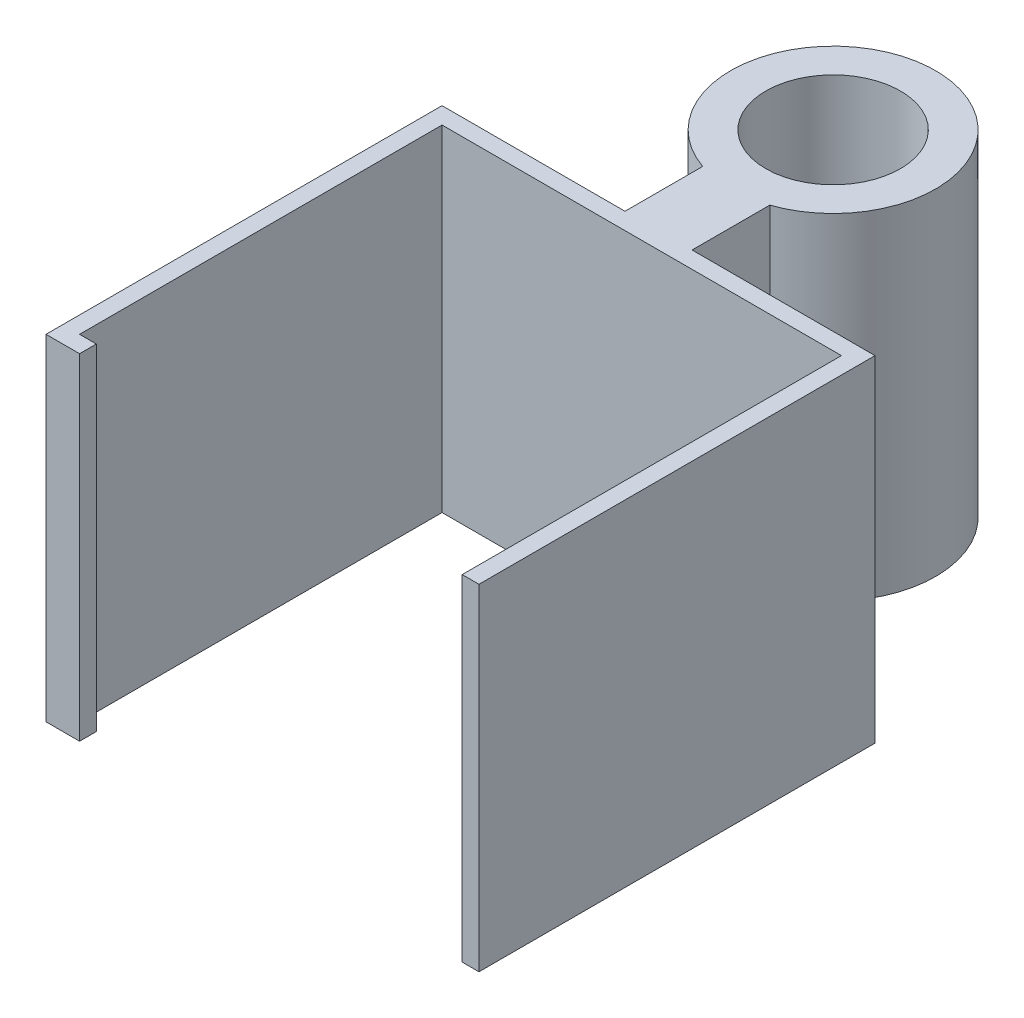
ISO-10303-21;
HEADER;
FILE_DESCRIPTION(('STEP AP214'),'2;1');
FILE_NAME('part.step','',(''),(''),'','','');
FILE_SCHEMA(('AUTOMOTIVE_DESIGN { 1 0 10303 214 1 1 1 1 }'));
ENDSEC;
DATA;
#1=APPLICATION_CONTEXT('core data for automotive mechanical design processes');
#2=APPLICATION_PROTOCOL_DEFINITION('international standard','automotive_design',2000,#1);
#3=PRODUCT_CONTEXT('',#1,'mechanical');
#4=PRODUCT('Part','Part','',(#3));
#5=PRODUCT_RELATED_PRODUCT_CATEGORY('part','',(#4));
#6=PRODUCT_DEFINITION_FORMATION('','',#4);
#7=PRODUCT_DEFINITION_CONTEXT('part definition',#1,'design');
#8=PRODUCT_DEFINITION('design','',#6,#7);
#9=PRODUCT_DEFINITION_SHAPE('','',#8);
#10=(LENGTH_UNIT() NAMED_UNIT(*) SI_UNIT(.MILLI.,.METRE.));
#11=(NAMED_UNIT(*) PLANE_ANGLE_UNIT() SI_UNIT($,.RADIAN.));
#12=(NAMED_UNIT(*) SI_UNIT($,.STERADIAN.) SOLID_ANGLE_UNIT());
#13=UNCERTAINTY_MEASURE_WITH_UNIT(LENGTH_MEASURE(1.E-05),#10,'distance_accuracy_value','');
#14=(GEOMETRIC_REPRESENTATION_CONTEXT(3) GLOBAL_UNCERTAINTY_ASSIGNED_CONTEXT((#13)) GLOBAL_UNIT_ASSIGNED_CONTEXT((#10,
#11,#12)) REPRESENTATION_CONTEXT('',''));
#15=CARTESIAN_POINT('',(0.,0.,0.));
#16=DIRECTION('',(0.,0.,1.));
#17=DIRECTION('',(1.,0.,0.));
#18=AXIS2_PLACEMENT_3D('',#15,#16,#17);
#19=CARTESIAN_POINT('',(-0.999288882711977,10.,-8.24246561615471));
#20=DIRECTION('',(1.,0.,0.));
#21=DIRECTION('',(0.,0.,-1.));
#22=AXIS2_PLACEMENT_3D('',#19,#20,#21);
#23=PLANE('',#22);
#24=DIRECTION('',(0.,-1.,0.));
#25=VECTOR('',#24,1.);
#26=CARTESIAN_POINT('',(-0.999288882711977,10.,-8.21480921571517));
#27=LINE('',#26,#25);
#28=CARTESIAN_POINT('',(-0.999288882711977,0.,-8.21480921571517));
#29=VERTEX_POINT('',#28);
#30=CARTESIAN_POINT('',(-0.999288882711977,10.,-8.21480921571517));
#31=VERTEX_POINT('',#30);
#32=EDGE_CURVE('E140',#29,#31,#27,.F.);
#33=ORIENTED_EDGE('',*,*,#32,.F.);
#34=DIRECTION('',(0.,0.,1.));
#35=VECTOR('',#34,1.);
#36=CARTESIAN_POINT('',(-0.999288882711977,0.,-8.24246561615471));
#37=LINE('',#36,#35);
#38=CARTESIAN_POINT('',(-0.999288882711977,0.,-5.9));
#39=VERTEX_POINT('',#38);
#40=EDGE_CURVE('E149',#29,#39,#37,.T.);
#41=ORIENTED_EDGE('',*,*,#40,.T.);
#42=DIRECTION('',(0.,-1.,0.));
#43=VECTOR('',#42,1.);
#44=CARTESIAN_POINT('',(-0.999288882711977,10.,-5.9));
#45=LINE('',#44,#43);
#46=CARTESIAN_POINT('',(-0.999288882711977,10.,-5.9));
#47=VERTEX_POINT('',#46);
#48=EDGE_CURVE('E171',#47,#39,#45,.T.);
#49=ORIENTED_EDGE('',*,*,#48,.F.);
#50=DIRECTION('',(0.,0.,1.));
#51=VECTOR('',#50,1.);
#52=CARTESIAN_POINT('',(-0.999288882711977,10.,-8.24246561615471));
#53=LINE('',#52,#51);
#54=EDGE_CURVE('E151',#31,#47,#53,.T.);
#55=ORIENTED_EDGE('',*,*,#54,.F.);
#56=EDGE_LOOP('',(#33,#41,#49,#55));
#57=FACE_BOUND('',#56,.T.);
#58=ADVANCED_FACE('F39',(#57),#23,.F.);
#59=CARTESIAN_POINT('',(0.999288882711974,10.,-8.24246561615471));
#60=DIRECTION('',(1.,0.,0.));
#61=DIRECTION('',(0.,0.,-1.));
#62=AXIS2_PLACEMENT_3D('',#59,#60,#61);
#63=PLANE('',#62);
#64=DIRECTION('',(0.,0.,1.));
#65=VECTOR('',#64,1.);
#66=CARTESIAN_POINT('',(0.999288882711974,0.,-8.24246561615471));
#67=LINE('',#66,#65);
#68=CARTESIAN_POINT('',(0.999288882711974,0.,-8.21480921571517));
#69=VERTEX_POINT('',#68);
#70=CARTESIAN_POINT('',(0.999288882711972,0.,-5.9));
#71=VERTEX_POINT('',#70);
#72=EDGE_CURVE('E60',#69,#71,#67,.T.);
#73=ORIENTED_EDGE('',*,*,#72,.F.);
#74=DIRECTION('',(0.,-1.,0.));
#75=VECTOR('',#74,1.);
#76=CARTESIAN_POINT('',(0.999288882711974,10.,-8.21480921571517));
#77=LINE('',#76,#75);
#78=CARTESIAN_POINT('',(0.999288882711974,10.,-8.21480921571517));
#79=VERTEX_POINT('',#78);
#80=EDGE_CURVE('E11',#69,#79,#77,.F.);
#81=ORIENTED_EDGE('',*,*,#80,.T.);
#82=DIRECTION('',(0.,0.,1.));
#83=VECTOR('',#82,1.);
#84=CARTESIAN_POINT('',(0.999288882711974,10.,-8.24246561615471));
#85=LINE('',#84,#83);
#86=CARTESIAN_POINT('',(0.999288882711974,10.,-5.9));
#87=VERTEX_POINT('',#86);
#88=EDGE_CURVE('E160',#79,#87,#85,.T.);
#89=ORIENTED_EDGE('',*,*,#88,.T.);
#90=DIRECTION('',(0.,-1.,0.));
#91=VECTOR('',#90,1.);
#92=CARTESIAN_POINT('',(0.999288882711974,10.,-5.9));
#93=LINE('',#92,#91);
#94=EDGE_CURVE('E168',#87,#71,#93,.T.);
#95=ORIENTED_EDGE('',*,*,#94,.T.);
#96=EDGE_LOOP('',(#73,#81,#89,#95));
#97=FACE_BOUND('',#96,.T.);
#98=ADVANCED_FACE('F329',(#97),#63,.T.);
#99=CARTESIAN_POINT('',(-6.45,10.,-5.9));
#100=DIRECTION('',(0.,0.,-1.));
#101=DIRECTION('',(-1.,0.,0.));
#102=AXIS2_PLACEMENT_3D('',#99,#100,#101);
#103=PLANE('',#102);
#104=DIRECTION('',(1.,0.,0.));
#105=VECTOR('',#104,1.);
#106=CARTESIAN_POINT('',(-6.45,10.,-5.9));
#107=LINE('',#106,#105);
#108=CARTESIAN_POINT('',(-6.45,10.,-5.9));
#109=VERTEX_POINT('',#108);
#110=EDGE_CURVE('E228',#109,#47,#107,.T.);
#111=ORIENTED_EDGE('',*,*,#110,.T.);
#112=ORIENTED_EDGE('',*,*,#48,.T.);
#113=DIRECTION('',(1.,0.,0.));
#114=VECTOR('',#113,1.);
#115=CARTESIAN_POINT('',(-6.45,0.,-5.9));
#116=LINE('',#115,#114);
#117=CARTESIAN_POINT('',(-6.45,0.,-5.9));
#118=VERTEX_POINT('',#117);
#119=EDGE_CURVE('E158',#118,#39,#116,.T.);
#120=ORIENTED_EDGE('',*,*,#119,.F.);
#121=DIRECTION('',(0.,-1.,0.));
#122=VECTOR('',#121,1.);
#123=CARTESIAN_POINT('',(-6.45,10.,-5.9));
#124=LINE('',#123,#122);
#125=EDGE_CURVE('E260',#109,#118,#124,.T.);
#126=ORIENTED_EDGE('',*,*,#125,.F.);
#127=EDGE_LOOP('',(#111,#112,#120,#126));
#128=FACE_BOUND('',#127,.T.);
#129=ADVANCED_FACE('F300',(#128),#103,.T.);
#130=CARTESIAN_POINT('',(-6.45,10.,5.9));
#131=DIRECTION('',(0.,0.,-1.));
#132=DIRECTION('',(-1.,0.,0.));
#133=AXIS2_PLACEMENT_3D('',#130,#131,#132);
#134=PLANE('',#133);
#135=DIRECTION('',(0.,-1.,0.));
#136=VECTOR('',#135,1.);
#137=CARTESIAN_POINT('',(-5.44902090029537,10.,5.9));
#138=LINE('',#137,#136);
#139=CARTESIAN_POINT('',(-5.44902090029537,10.,5.9));
#140=VERTEX_POINT('',#139);
#141=CARTESIAN_POINT('',(-5.44902090029537,0.,5.9));
#142=VERTEX_POINT('',#141);
#143=EDGE_CURVE('E182',#140,#142,#138,.T.);
#144=ORIENTED_EDGE('',*,*,#143,.F.);
#145=DIRECTION('',(1.,0.,0.));
#146=VECTOR('',#145,1.);
#147=CARTESIAN_POINT('',(-6.45,10.,5.9));
#148=LINE('',#147,#146);
#149=CARTESIAN_POINT('',(-6.45,10.,5.9));
#150=VERTEX_POINT('',#149);
#151=EDGE_CURVE('E238',#150,#140,#148,.T.);
#152=ORIENTED_EDGE('',*,*,#151,.F.);
#153=DIRECTION('',(0.,-1.,0.));
#154=VECTOR('',#153,1.);
#155=CARTESIAN_POINT('',(-6.45,10.,5.9));
#156=LINE('',#155,#154);
#157=CARTESIAN_POINT('',(-6.45,0.,5.9));
#158=VERTEX_POINT('',#157);
#159=EDGE_CURVE('E263',#150,#158,#156,.T.);
#160=ORIENTED_EDGE('',*,*,#159,.T.);
#161=DIRECTION('',(1.,0.,0.));
#162=VECTOR('',#161,1.);
#163=CARTESIAN_POINT('',(-6.45,0.,5.9));
#164=LINE('',#163,#162);
#165=EDGE_CURVE('E253',#158,#142,#164,.T.);
#166=ORIENTED_EDGE('',*,*,#165,.T.);
#167=EDGE_LOOP('',(#144,#152,#160,#166));
#168=FACE_BOUND('',#167,.T.);
#169=ADVANCED_FACE('F296',(#168),#134,.F.);
#170=CARTESIAN_POINT('',(-5.95,10.,5.4));
#171=DIRECTION('',(0.,0.,-1.));
#172=DIRECTION('',(-1.,0.,0.));
#173=AXIS2_PLACEMENT_3D('',#170,#171,#172);
#174=PLANE('',#173);
#175=DIRECTION('',(1.,0.,0.));
#176=VECTOR('',#175,1.);
#177=CARTESIAN_POINT('',(-5.95,10.,5.4));
#178=LINE('',#177,#176);
#179=CARTESIAN_POINT('',(-5.95,10.,5.4));
#180=VERTEX_POINT('',#179);
#181=CARTESIAN_POINT('',(-5.44902090029537,10.,5.4));
#182=VERTEX_POINT('',#181);
#183=EDGE_CURVE('E200',#180,#182,#178,.T.);
#184=ORIENTED_EDGE('',*,*,#183,.T.);
#185=DIRECTION('',(0.,-1.,0.));
#186=VECTOR('',#185,1.);
#187=CARTESIAN_POINT('',(-5.44902090029537,10.,5.4));
#188=LINE('',#187,#186);
#189=CARTESIAN_POINT('',(-5.44902090029537,0.,5.4));
#190=VERTEX_POINT('',#189);
#191=EDGE_CURVE('E48',#182,#190,#188,.T.);
#192=ORIENTED_EDGE('',*,*,#191,.T.);
#193=DIRECTION('',(1.,0.,0.));
#194=VECTOR('',#193,1.);
#195=CARTESIAN_POINT('',(-5.95,0.,5.4));
#196=LINE('',#195,#194);
#197=CARTESIAN_POINT('',(-5.95,0.,5.4));
#198=VERTEX_POINT('',#197);
#199=EDGE_CURVE('E193',#198,#190,#196,.T.);
#200=ORIENTED_EDGE('',*,*,#199,.F.);
#201=DIRECTION('',(0.,-1.,0.));
#202=VECTOR('',#201,1.);
#203=CARTESIAN_POINT('',(-5.95,10.,5.4));
#204=LINE('',#203,#202);
#205=EDGE_CURVE('E204',#180,#198,#204,.T.);
#206=ORIENTED_EDGE('',*,*,#205,.F.);
#207=EDGE_LOOP('',(#184,#192,#200,#206));
#208=FACE_BOUND('',#207,.T.);
#209=ADVANCED_FACE('F277',(#208),#174,.T.);
#210=CARTESIAN_POINT('',(0.,10.,0.));
#211=DIRECTION('',(0.,-1.,0.));
#212=DIRECTION('',(0.,0.,-1.));
#213=AXIS2_PLACEMENT_3D('',#210,#211,#212);
#214=PLANE('',#213);
#215=CARTESIAN_POINT('',(0.,10.,-11.101611725942));
#216=DIRECTION('',(0.,1.,0.));
#217=DIRECTION('',(0.,0.,1.));
#218=AXIS2_PLACEMENT_3D('',#215,#216,#217);
#219=CIRCLE('',#218,2.0063778582326);
#220=CARTESIAN_POINT('',(0.,10.,-9.09523386770937));
#221=VERTEX_POINT('',#220);
#222=EDGE_CURVE('E144',#221,#221,#219,.T.);
#223=ORIENTED_EDGE('',*,*,#222,.F.);
#224=EDGE_LOOP('',(#223));
#225=FACE_BOUND('',#224,.T.);
#226=ORIENTED_EDGE('',*,*,#88,.F.);
#227=CARTESIAN_POINT('',(0.,10.,-11.101611725942));
#228=DIRECTION('',(0.,1.,0.));
#229=DIRECTION('',(0.,0.,1.));
#230=AXIS2_PLACEMENT_3D('',#227,#228,#229);
#231=CIRCLE('',#230,3.05486611886077);
#232=EDGE_CURVE('E143',#79,#31,#231,.T.);
#233=ORIENTED_EDGE('',*,*,#232,.T.);
#234=ORIENTED_EDGE('',*,*,#54,.T.);
#235=ORIENTED_EDGE('',*,*,#110,.F.);
#236=DIRECTION('',(0.,0.,1.));
#237=VECTOR('',#236,1.);
#238=CARTESIAN_POINT('',(-6.45,10.,-5.9));
#239=LINE('',#238,#237);
#240=EDGE_CURVE('E242',#109,#150,#239,.T.);
#241=ORIENTED_EDGE('',*,*,#240,.T.);
#242=ORIENTED_EDGE('',*,*,#151,.T.);
#243=DIRECTION('',(0.,0.,1.));
#244=VECTOR('',#243,1.);
#245=CARTESIAN_POINT('',(-5.44902090029537,10.,0.));
#246=LINE('',#245,#244);
#247=EDGE_CURVE('E175',#182,#140,#246,.T.);
#248=ORIENTED_EDGE('',*,*,#247,.F.);
#249=ORIENTED_EDGE('',*,*,#183,.F.);
#250=DIRECTION('',(0.,0.,1.));
#251=VECTOR('',#250,1.);
#252=CARTESIAN_POINT('',(-5.95,10.,-5.4));
#253=LINE('',#252,#251);
#254=CARTESIAN_POINT('',(-5.95,10.,-5.4));
#255=VERTEX_POINT('',#254);
#256=EDGE_CURVE('E196',#255,#180,#253,.T.);
#257=ORIENTED_EDGE('',*,*,#256,.F.);
#258=DIRECTION('',(-1.,0.,0.));
#259=VECTOR('',#258,1.);
#260=CARTESIAN_POINT('',(-5.95,10.,-5.4));
#261=LINE('',#260,#259);
#262=CARTESIAN_POINT('',(5.95,10.,-5.4));
#263=VERTEX_POINT('',#262);
#264=EDGE_CURVE('E192',#263,#255,#261,.T.);
#265=ORIENTED_EDGE('',*,*,#264,.F.);
#266=DIRECTION('',(0.,0.,-1.));
#267=VECTOR('',#266,1.);
#268=CARTESIAN_POINT('',(5.95,10.,-5.4));
#269=LINE('',#268,#267);
#270=CARTESIAN_POINT('',(5.95,10.,5.9));
#271=VERTEX_POINT('',#270);
#272=EDGE_CURVE('E189',#271,#263,#269,.T.);
#273=ORIENTED_EDGE('',*,*,#272,.F.);
#274=CARTESIAN_POINT('',(6.45,10.,5.9));
#275=VERTEX_POINT('',#274);
#276=EDGE_CURVE('E237',#271,#275,#148,.T.);
#277=ORIENTED_EDGE('',*,*,#276,.T.);
#278=DIRECTION('',(0.,0.,1.));
#279=VECTOR('',#278,1.);
#280=CARTESIAN_POINT('',(6.45,10.,-5.9));
#281=LINE('',#280,#279);
#282=CARTESIAN_POINT('',(6.45,10.,-5.9));
#283=VERTEX_POINT('',#282);
#284=EDGE_CURVE('E232',#283,#275,#281,.T.);
#285=ORIENTED_EDGE('',*,*,#284,.F.);
#286=EDGE_CURVE('E233',#87,#283,#107,.T.);
#287=ORIENTED_EDGE('',*,*,#286,.F.);
#288=EDGE_LOOP('',(#226,#233,#234,#235,#241,#242,#248,#249,#257,#265,#273,#277,#285,#287));
#289=FACE_BOUND('',#288,.T.);
#290=ADVANCED_FACE('F291',(#225,#289),#214,.F.);
#291=CARTESIAN_POINT('',(0.,0.,0.));
#292=DIRECTION('',(0.,-1.,0.));
#293=DIRECTION('',(0.,0.,-1.));
#294=AXIS2_PLACEMENT_3D('',#291,#292,#293);
#295=PLANE('',#294);
#296=CARTESIAN_POINT('',(0.,0.,-11.101611725942));
#297=DIRECTION('',(0.,1.,0.));
#298=DIRECTION('',(0.,0.,1.));
#299=AXIS2_PLACEMENT_3D('',#296,#297,#298);
#300=CIRCLE('',#299,2.0063778582326);
#301=CARTESIAN_POINT('',(0.,0.,-9.09523386770937));
#302=VERTEX_POINT('',#301);
#303=EDGE_CURVE('E307',#302,#302,#300,.T.);
#304=ORIENTED_EDGE('',*,*,#303,.T.);
#305=EDGE_LOOP('',(#304));
#306=FACE_BOUND('',#305,.T.);
#307=ORIENTED_EDGE('',*,*,#40,.F.);
#308=CARTESIAN_POINT('',(0.,0.,-11.101611725942));
#309=DIRECTION('',(0.,1.,0.));
#310=DIRECTION('',(0.,0.,1.));
#311=AXIS2_PLACEMENT_3D('',#308,#309,#310);
#312=CIRCLE('',#311,3.05486611886077);
#313=EDGE_CURVE('E55',#69,#29,#312,.T.);
#314=ORIENTED_EDGE('',*,*,#313,.F.);
#315=ORIENTED_EDGE('',*,*,#72,.T.);
#316=CARTESIAN_POINT('',(6.45,0.,-5.9));
#317=VERTEX_POINT('',#316);
#318=EDGE_CURVE('E227',#71,#317,#116,.T.);
#319=ORIENTED_EDGE('',*,*,#318,.T.);
#320=DIRECTION('',(0.,0.,1.));
#321=VECTOR('',#320,1.);
#322=CARTESIAN_POINT('',(6.45,0.,-5.9));
#323=LINE('',#322,#321);
#324=CARTESIAN_POINT('',(6.45,0.,5.9));
#325=VERTEX_POINT('',#324);
#326=EDGE_CURVE('E248',#317,#325,#323,.T.);
#327=ORIENTED_EDGE('',*,*,#326,.T.);
#328=CARTESIAN_POINT('',(5.95,0.,5.9));
#329=VERTEX_POINT('',#328);
#330=EDGE_CURVE('E252',#329,#325,#164,.T.);
#331=ORIENTED_EDGE('',*,*,#330,.F.);
#332=DIRECTION('',(0.,0.,-1.));
#333=VECTOR('',#332,1.);
#334=CARTESIAN_POINT('',(5.95,0.,-5.4));
#335=LINE('',#334,#333);
#336=CARTESIAN_POINT('',(5.95,0.,-5.4));
#337=VERTEX_POINT('',#336);
#338=EDGE_CURVE('E185',#329,#337,#335,.T.);
#339=ORIENTED_EDGE('',*,*,#338,.T.);
#340=DIRECTION('',(-1.,0.,0.));
#341=VECTOR('',#340,1.);
#342=CARTESIAN_POINT('',(-5.95,0.,-5.4));
#343=LINE('',#342,#341);
#344=CARTESIAN_POINT('',(-5.95,0.,-5.4));
#345=VERTEX_POINT('',#344);
#346=EDGE_CURVE('E207',#337,#345,#343,.T.);
#347=ORIENTED_EDGE('',*,*,#346,.T.);
#348=DIRECTION('',(0.,0.,1.));
#349=VECTOR('',#348,1.);
#350=CARTESIAN_POINT('',(-5.95,0.,-5.4));
#351=LINE('',#350,#349);
#352=EDGE_CURVE('E210',#345,#198,#351,.T.);
#353=ORIENTED_EDGE('',*,*,#352,.T.);
#354=ORIENTED_EDGE('',*,*,#199,.T.);
#355=DIRECTION('',(0.,0.,1.));
#356=VECTOR('',#355,1.);
#357=CARTESIAN_POINT('',(-5.44902090029537,0.,0.));
#358=LINE('',#357,#356);
#359=EDGE_CURVE('E174',#190,#142,#358,.T.);
#360=ORIENTED_EDGE('',*,*,#359,.T.);
#361=ORIENTED_EDGE('',*,*,#165,.F.);
#362=DIRECTION('',(0.,0.,1.));
#363=VECTOR('',#362,1.);
#364=CARTESIAN_POINT('',(-6.45,0.,-5.9));
#365=LINE('',#364,#363);
#366=EDGE_CURVE('E257',#118,#158,#365,.T.);
#367=ORIENTED_EDGE('',*,*,#366,.F.);
#368=ORIENTED_EDGE('',*,*,#119,.T.);
#369=EDGE_LOOP('',(#307,#314,#315,#319,#327,#331,#339,#347,#353,#354,#360,#361,#367,#368));
#370=FACE_BOUND('',#369,.T.);
#371=ADVANCED_FACE('F155',(#306,#370),#295,.T.);
#372=ORIENTED_EDGE('',*,*,#94,.F.);
#373=ORIENTED_EDGE('',*,*,#286,.T.);
#374=DIRECTION('',(0.,-1.,0.));
#375=VECTOR('',#374,1.);
#376=CARTESIAN_POINT('',(6.45,10.,-5.9));
#377=LINE('',#376,#375);
#378=EDGE_CURVE('E245',#283,#317,#377,.T.);
#379=ORIENTED_EDGE('',*,*,#378,.T.);
#380=ORIENTED_EDGE('',*,*,#318,.F.);
#381=EDGE_LOOP('',(#372,#373,#379,#380));
#382=FACE_BOUND('',#381,.T.);
#383=ADVANCED_FACE('F41',(#382),#103,.T.);
#384=CARTESIAN_POINT('',(-6.45,10.,-5.9));
#385=DIRECTION('',(1.,0.,0.));
#386=DIRECTION('',(0.,0.,-1.));
#387=AXIS2_PLACEMENT_3D('',#384,#385,#386);
#388=PLANE('',#387);
#389=ORIENTED_EDGE('',*,*,#366,.T.);
#390=ORIENTED_EDGE('',*,*,#159,.F.);
#391=ORIENTED_EDGE('',*,*,#240,.F.);
#392=ORIENTED_EDGE('',*,*,#125,.T.);
#393=EDGE_LOOP('',(#389,#390,#391,#392));
#394=FACE_BOUND('',#393,.T.);
#395=ADVANCED_FACE('F373',(#394),#388,.F.);
#396=ORIENTED_EDGE('',*,*,#276,.F.);
#397=DIRECTION('',(0.,-1.,0.));
#398=VECTOR('',#397,1.);
#399=CARTESIAN_POINT('',(5.95,10.,5.9));
#400=LINE('',#399,#398);
#401=EDGE_CURVE('E178',#271,#329,#400,.T.);
#402=ORIENTED_EDGE('',*,*,#401,.T.);
#403=ORIENTED_EDGE('',*,*,#330,.T.);
#404=DIRECTION('',(0.,-1.,0.));
#405=VECTOR('',#404,1.);
#406=CARTESIAN_POINT('',(6.45,10.,5.9));
#407=LINE('',#406,#405);
#408=EDGE_CURVE('E267',#275,#325,#407,.T.);
#409=ORIENTED_EDGE('',*,*,#408,.F.);
#410=EDGE_LOOP('',(#396,#402,#403,#409));
#411=FACE_BOUND('',#410,.T.);
#412=ADVANCED_FACE('F353',(#411),#134,.F.);
#413=CARTESIAN_POINT('',(6.45,10.,-5.9));
#414=DIRECTION('',(1.,0.,0.));
#415=DIRECTION('',(0.,0.,-1.));
#416=AXIS2_PLACEMENT_3D('',#413,#414,#415);
#417=PLANE('',#416);
#418=ORIENTED_EDGE('',*,*,#326,.F.);
#419=ORIENTED_EDGE('',*,*,#378,.F.);
#420=ORIENTED_EDGE('',*,*,#284,.T.);
#421=ORIENTED_EDGE('',*,*,#408,.T.);
#422=EDGE_LOOP('',(#418,#419,#420,#421));
#423=FACE_BOUND('',#422,.T.);
#424=ADVANCED_FACE('F348',(#423),#417,.T.);
#425=CARTESIAN_POINT('',(5.95,10.,-5.4));
#426=DIRECTION('',(-1.,0.,0.));
#427=DIRECTION('',(0.,0.,1.));
#428=AXIS2_PLACEMENT_3D('',#425,#426,#427);
#429=PLANE('',#428);
#430=ORIENTED_EDGE('',*,*,#272,.T.);
#431=DIRECTION('',(0.,-1.,0.));
#432=VECTOR('',#431,1.);
#433=CARTESIAN_POINT('',(5.95,10.,-5.4));
#434=LINE('',#433,#432);
#435=EDGE_CURVE('E223',#263,#337,#434,.T.);
#436=ORIENTED_EDGE('',*,*,#435,.T.);
#437=ORIENTED_EDGE('',*,*,#338,.F.);
#438=ORIENTED_EDGE('',*,*,#401,.F.);
#439=EDGE_LOOP('',(#430,#436,#437,#438));
#440=FACE_BOUND('',#439,.T.);
#441=ADVANCED_FACE('F345',(#440),#429,.T.);
#442=CARTESIAN_POINT('',(-5.95,10.,-5.4));
#443=DIRECTION('',(0.,0.,1.));
#444=DIRECTION('',(1.,0.,0.));
#445=AXIS2_PLACEMENT_3D('',#442,#443,#444);
#446=PLANE('',#445);
#447=ORIENTED_EDGE('',*,*,#264,.T.);
#448=DIRECTION('',(0.,-1.,0.));
#449=VECTOR('',#448,1.);
#450=CARTESIAN_POINT('',(-5.95,10.,-5.4));
#451=LINE('',#450,#449);
#452=EDGE_CURVE('E219',#255,#345,#451,.T.);
#453=ORIENTED_EDGE('',*,*,#452,.T.);
#454=ORIENTED_EDGE('',*,*,#346,.F.);
#455=ORIENTED_EDGE('',*,*,#435,.F.);
#456=EDGE_LOOP('',(#447,#453,#454,#455));
#457=FACE_BOUND('',#456,.T.);
#458=ADVANCED_FACE('F343',(#457),#446,.T.);
#459=CARTESIAN_POINT('',(-5.95,10.,-5.4));
#460=DIRECTION('',(1.,0.,0.));
#461=DIRECTION('',(0.,0.,-1.));
#462=AXIS2_PLACEMENT_3D('',#459,#460,#461);
#463=PLANE('',#462);
#464=ORIENTED_EDGE('',*,*,#352,.F.);
#465=ORIENTED_EDGE('',*,*,#452,.F.);
#466=ORIENTED_EDGE('',*,*,#256,.T.);
#467=ORIENTED_EDGE('',*,*,#205,.T.);
#468=EDGE_LOOP('',(#464,#465,#466,#467));
#469=FACE_BOUND('',#468,.T.);
#470=ADVANCED_FACE('F286',(#469),#463,.T.);
#471=CARTESIAN_POINT('',(-5.44902090029537,10.,0.));
#472=DIRECTION('',(1.,0.,0.));
#473=DIRECTION('',(0.,0.,-1.));
#474=AXIS2_PLACEMENT_3D('',#471,#472,#473);
#475=PLANE('',#474);
#476=ORIENTED_EDGE('',*,*,#247,.T.);
#477=ORIENTED_EDGE('',*,*,#143,.T.);
#478=ORIENTED_EDGE('',*,*,#359,.F.);
#479=ORIENTED_EDGE('',*,*,#191,.F.);
#480=EDGE_LOOP('',(#476,#477,#478,#479));
#481=FACE_BOUND('',#480,.T.);
#482=ADVANCED_FACE('F294',(#481),#475,.T.);
#483=CARTESIAN_POINT('',(0.,10.,-11.101611725942));
#484=DIRECTION('',(0.,-1.,0.));
#485=DIRECTION('',(0.,0.,-1.));
#486=AXIS2_PLACEMENT_3D('',#483,#484,#485);
#487=CYLINDRICAL_SURFACE('',#486,3.05486611886077);
#488=ORIENTED_EDGE('',*,*,#313,.T.);
#489=ORIENTED_EDGE('',*,*,#32,.T.);
#490=ORIENTED_EDGE('',*,*,#232,.F.);
#491=ORIENTED_EDGE('',*,*,#80,.F.);
#492=EDGE_LOOP('',(#488,#489,#490,#491));
#493=FACE_BOUND('',#492,.T.);
#494=ADVANCED_FACE('F139',(#493),#487,.T.);
#495=CARTESIAN_POINT('',(0.,10.,-11.101611725942));
#496=DIRECTION('',(0.,-1.,0.));
#497=DIRECTION('',(0.,0.,-1.));
#498=AXIS2_PLACEMENT_3D('',#495,#496,#497);
#499=CYLINDRICAL_SURFACE('',#498,2.0063778582326);
#500=ORIENTED_EDGE('',*,*,#222,.T.);
#501=EDGE_LOOP('',(#500));
#502=FACE_BOUND('',#501,.T.);
#503=ORIENTED_EDGE('',*,*,#303,.F.);
#504=EDGE_LOOP('',(#503));
#505=FACE_BOUND('',#504,.T.);
#506=ADVANCED_FACE('F315',(#502,#505),#499,.F.);
#507=CLOSED_SHELL('',(#58,#98,#129,#169,#209,#290,#371,#383,#395,#412,#424,#441,#458,#470,#482,
#494,#506));
#508=MANIFOLD_SOLID_BREP('B2',#507);
#509=ADVANCED_BREP_SHAPE_REPRESENTATION('',(#18,#508),#14);
#510=SHAPE_DEFINITION_REPRESENTATION(#9,#509);
ENDSEC;
END-ISO-10303-21;
